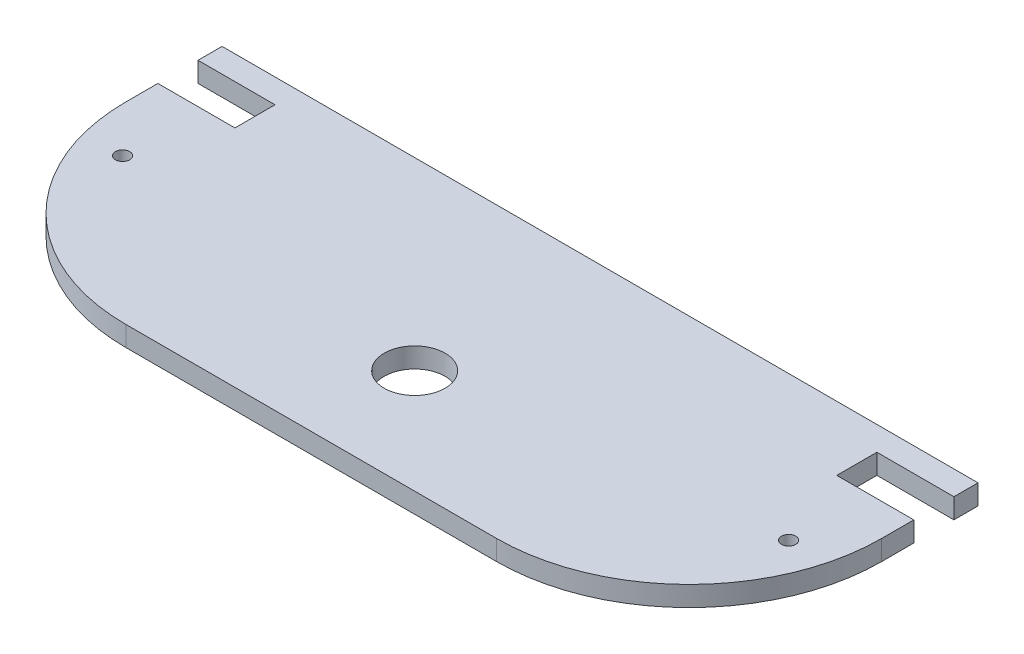
ISO-10303-21;
HEADER;
FILE_DESCRIPTION(('STEP AP214'),'2;1');
FILE_NAME('part.step','',(''),(''),'','','');
FILE_SCHEMA(('AUTOMOTIVE_DESIGN { 1 0 10303 214 1 1 1 1 }'));
ENDSEC;
DATA;
#1=APPLICATION_CONTEXT('core data for automotive mechanical design processes');
#2=APPLICATION_PROTOCOL_DEFINITION('international standard','automotive_design',2000,#1);
#3=PRODUCT_CONTEXT('',#1,'mechanical');
#4=PRODUCT('Part','Part','',(#3));
#5=PRODUCT_RELATED_PRODUCT_CATEGORY('part','',(#4));
#6=PRODUCT_DEFINITION_FORMATION('','',#4);
#7=PRODUCT_DEFINITION_CONTEXT('part definition',#1,'design');
#8=PRODUCT_DEFINITION('design','',#6,#7);
#9=PRODUCT_DEFINITION_SHAPE('','',#8);
#10=(LENGTH_UNIT() NAMED_UNIT(*) SI_UNIT(.MILLI.,.METRE.));
#11=(NAMED_UNIT(*) PLANE_ANGLE_UNIT() SI_UNIT($,.RADIAN.));
#12=(NAMED_UNIT(*) SI_UNIT($,.STERADIAN.) SOLID_ANGLE_UNIT());
#13=UNCERTAINTY_MEASURE_WITH_UNIT(LENGTH_MEASURE(1.E-05),#10,'distance_accuracy_value','');
#14=(GEOMETRIC_REPRESENTATION_CONTEXT(3) GLOBAL_UNCERTAINTY_ASSIGNED_CONTEXT((#13)) GLOBAL_UNIT_ASSIGNED_CONTEXT((#10,
#11,#12)) REPRESENTATION_CONTEXT('',''));
#15=CARTESIAN_POINT('',(0.,0.,0.));
#16=DIRECTION('',(0.,0.,1.));
#17=DIRECTION('',(1.,0.,0.));
#18=AXIS2_PLACEMENT_3D('',#15,#16,#17);
#19=CARTESIAN_POINT('',(0.,3.175,0.));
#20=DIRECTION('',(0.,-1.,0.));
#21=DIRECTION('',(0.,0.,-1.));
#22=AXIS2_PLACEMENT_3D('',#19,#20,#21);
#23=PLANE('',#22);
#24=CARTESIAN_POINT('',(112.521999999993,3.175,-22.8599999999932));
#25=DIRECTION('',(0.,-1.,0.));
#26=DIRECTION('',(0.,0.,-1.));
#27=AXIS2_PLACEMENT_3D('',#24,#25,#26);
#28=CIRCLE('',#27,1.1303);
#29=CARTESIAN_POINT('',(112.521999999993,3.175,-23.9902999999932));
#30=VERTEX_POINT('',#29);
#31=EDGE_CURVE('E297',#30,#30,#28,.T.);
#32=ORIENTED_EDGE('',*,*,#31,.T.);
#33=EDGE_LOOP('',(#32));
#34=FACE_BOUND('',#33,.T.);
#35=CARTESIAN_POINT('',(7.11199999999325,3.175,-22.8599999999929));
#36=DIRECTION('',(0.,-1.,0.));
#37=DIRECTION('',(0.,0.,-1.));
#38=AXIS2_PLACEMENT_3D('',#35,#36,#37);
#39=CIRCLE('',#38,1.1303);
#40=CARTESIAN_POINT('',(7.11199999999325,3.175,-23.9902999999929));
#41=VERTEX_POINT('',#40);
#42=EDGE_CURVE('E279',#41,#41,#39,.T.);
#43=ORIENTED_EDGE('',*,*,#42,.T.);
#44=EDGE_LOOP('',(#43));
#45=FACE_BOUND('',#44,.T.);
#46=DIRECTION('',(0.,0.,1.));
#47=VECTOR('',#46,1.);
#48=CARTESIAN_POINT('',(0.,3.175,0.));
#49=LINE('',#48,#47);
#50=CARTESIAN_POINT('',(0.,3.175,-35.56));
#51=VERTEX_POINT('',#50);
#52=CARTESIAN_POINT('',(0.,3.175,-30.48));
#53=VERTEX_POINT('',#52);
#54=EDGE_CURVE('E219',#51,#53,#49,.T.);
#55=ORIENTED_EDGE('',*,*,#54,.T.);
#56=CARTESIAN_POINT('',(30.48,3.175,-30.48));
#57=DIRECTION('',(0.,-1.,0.));
#58=DIRECTION('',(0.,0.,-1.));
#59=AXIS2_PLACEMENT_3D('',#56,#57,#58);
#60=CIRCLE('',#59,30.48);
#61=CARTESIAN_POINT('',(30.48,3.175,0.));
#62=VERTEX_POINT('',#61);
#63=EDGE_CURVE('E55',#53,#62,#60,.F.);
#64=ORIENTED_EDGE('',*,*,#63,.T.);
#65=DIRECTION('',(1.,0.,0.));
#66=VECTOR('',#65,1.);
#67=CARTESIAN_POINT('',(0.,3.175,0.));
#68=LINE('',#67,#66);
#69=CARTESIAN_POINT('',(89.154,3.175,0.));
#70=VERTEX_POINT('',#69);
#71=EDGE_CURVE('E221',#62,#70,#68,.T.);
#72=ORIENTED_EDGE('',*,*,#71,.T.);
#73=CARTESIAN_POINT('',(89.154,3.175,-30.48));
#74=DIRECTION('',(0.,-1.,0.));
#75=DIRECTION('',(0.,0.,-1.));
#76=AXIS2_PLACEMENT_3D('',#73,#74,#75);
#77=CIRCLE('',#76,30.48);
#78=CARTESIAN_POINT('',(119.634,3.175,-30.48));
#79=VERTEX_POINT('',#78);
#80=EDGE_CURVE('E62',#70,#79,#77,.F.);
#81=ORIENTED_EDGE('',*,*,#80,.T.);
#82=DIRECTION('',(0.,0.,-1.));
#83=VECTOR('',#82,1.);
#84=CARTESIAN_POINT('',(119.634,3.175,0.));
#85=LINE('',#84,#83);
#86=CARTESIAN_POINT('',(119.634,3.175,-35.56));
#87=VERTEX_POINT('',#86);
#88=EDGE_CURVE('E224',#79,#87,#85,.T.);
#89=ORIENTED_EDGE('',*,*,#88,.T.);
#90=DIRECTION('',(1.,0.,0.));
#91=VECTOR('',#90,1.);
#92=CARTESIAN_POINT('',(119.634,3.175,-35.56));
#93=LINE('',#92,#91);
#94=CARTESIAN_POINT('',(107.442,3.175,-35.56));
#95=VERTEX_POINT('',#94);
#96=EDGE_CURVE('E199',#95,#87,#93,.T.);
#97=ORIENTED_EDGE('',*,*,#96,.F.);
#98=DIRECTION('',(0.,0.,1.));
#99=VECTOR('',#98,1.);
#100=CARTESIAN_POINT('',(107.442,3.175,-41.91));
#101=LINE('',#100,#99);
#102=CARTESIAN_POINT('',(107.442,3.175,-41.91));
#103=VERTEX_POINT('',#102);
#104=EDGE_CURVE('E192',#103,#95,#101,.T.);
#105=ORIENTED_EDGE('',*,*,#104,.F.);
#106=DIRECTION('',(1.,0.,0.));
#107=VECTOR('',#106,1.);
#108=CARTESIAN_POINT('',(119.633999999994,3.17499999998344,-41.91));
#109=LINE('',#108,#107);
#110=CARTESIAN_POINT('',(119.633999999994,3.17499999998344,-41.91));
#111=VERTEX_POINT('',#110);
#112=EDGE_CURVE('E284',#103,#111,#109,.T.);
#113=ORIENTED_EDGE('',*,*,#112,.T.);
#114=DIRECTION('',(0.,0.,1.));
#115=VECTOR('',#114,1.);
#116=CARTESIAN_POINT('',(119.633999999994,3.17499999998344,-45.72));
#117=LINE('',#116,#115);
#118=CARTESIAN_POINT('',(119.633999999994,3.17499999998344,-45.72));
#119=VERTEX_POINT('',#118);
#120=EDGE_CURVE('E286',#119,#111,#117,.T.);
#121=ORIENTED_EDGE('',*,*,#120,.F.);
#122=DIRECTION('',(1.,0.,0.));
#123=VECTOR('',#122,1.);
#124=CARTESIAN_POINT('',(119.633999999994,3.17499999998344,-45.72));
#125=LINE('',#124,#123);
#126=CARTESIAN_POINT('',(-5.81479309147426E-12,3.17499999998344,-45.72));
#127=VERTEX_POINT('',#126);
#128=EDGE_CURVE('E170',#127,#119,#125,.T.);
#129=ORIENTED_EDGE('',*,*,#128,.F.);
#130=DIRECTION('',(0.,0.,1.));
#131=VECTOR('',#130,1.);
#132=CARTESIAN_POINT('',(-5.81479309147426E-12,3.17499999998344,-45.72));
#133=LINE('',#132,#131);
#134=CARTESIAN_POINT('',(-5.81479309147426E-12,3.17499999998344,-41.91));
#135=VERTEX_POINT('',#134);
#136=EDGE_CURVE('E184',#127,#135,#133,.T.);
#137=ORIENTED_EDGE('',*,*,#136,.T.);
#138=CARTESIAN_POINT('',(12.192,3.175,-41.91));
#139=VERTEX_POINT('',#138);
#140=EDGE_CURVE('E174',#135,#139,#109,.T.);
#141=ORIENTED_EDGE('',*,*,#140,.T.);
#142=DIRECTION('',(0.,0.,-1.));
#143=VECTOR('',#142,1.);
#144=CARTESIAN_POINT('',(12.192,3.175,-41.91));
#145=LINE('',#144,#143);
#146=CARTESIAN_POINT('',(12.192,3.175,-35.56));
#147=VERTEX_POINT('',#146);
#148=EDGE_CURVE('E191',#147,#139,#145,.T.);
#149=ORIENTED_EDGE('',*,*,#148,.F.);
#150=DIRECTION('',(1.,0.,0.));
#151=VECTOR('',#150,1.);
#152=CARTESIAN_POINT('',(0.,3.175,-35.56));
#153=LINE('',#152,#151);
#154=EDGE_CURVE('E188',#51,#147,#153,.T.);
#155=ORIENTED_EDGE('',*,*,#154,.F.);
#156=EDGE_LOOP('',(#55,#64,#72,#81,#89,#97,#105,#113,#121,#129,#137,#141,#149,#155));
#157=FACE_BOUND('',#156,.T.);
#158=CARTESIAN_POINT('',(59.69,3.175,-16.51));
#159=DIRECTION('',(0.,1.,0.));
#160=DIRECTION('',(0.,0.,1.));
#161=AXIS2_PLACEMENT_3D('',#158,#159,#160);
#162=CIRCLE('',#161,4.81329999999998);
#163=CARTESIAN_POINT('',(59.69,3.175,-11.6967));
#164=VERTEX_POINT('',#163);
#165=EDGE_CURVE('E213',#164,#164,#162,.T.);
#166=ORIENTED_EDGE('',*,*,#165,.F.);
#167=EDGE_LOOP('',(#166));
#168=FACE_BOUND('',#167,.T.);
#169=ADVANCED_FACE('F47',(#34,#45,#157,#168),#23,.F.);
#170=CARTESIAN_POINT('',(0.,0.,0.));
#171=DIRECTION('',(0.,-1.,0.));
#172=DIRECTION('',(0.,0.,-1.));
#173=AXIS2_PLACEMENT_3D('',#170,#171,#172);
#174=PLANE('',#173);
#175=CARTESIAN_POINT('',(112.521999999993,0.,-22.8599999999932));
#176=DIRECTION('',(0.,-1.,0.));
#177=DIRECTION('',(0.,0.,-1.));
#178=AXIS2_PLACEMENT_3D('',#175,#176,#177);
#179=CIRCLE('',#178,1.1303);
#180=CARTESIAN_POINT('',(112.521999999993,0.,-23.9902999999932));
#181=VERTEX_POINT('',#180);
#182=EDGE_CURVE('E300',#181,#181,#179,.T.);
#183=ORIENTED_EDGE('',*,*,#182,.F.);
#184=EDGE_LOOP('',(#183));
#185=FACE_BOUND('',#184,.T.);
#186=CARTESIAN_POINT('',(7.11199999999325,0.,-22.8599999999929));
#187=DIRECTION('',(0.,-1.,0.));
#188=DIRECTION('',(0.,0.,-1.));
#189=AXIS2_PLACEMENT_3D('',#186,#187,#188);
#190=CIRCLE('',#189,1.1303);
#191=CARTESIAN_POINT('',(7.11199999999325,0.,-23.9902999999929));
#192=VERTEX_POINT('',#191);
#193=EDGE_CURVE('E294',#192,#192,#190,.T.);
#194=ORIENTED_EDGE('',*,*,#193,.F.);
#195=EDGE_LOOP('',(#194));
#196=FACE_BOUND('',#195,.T.);
#197=DIRECTION('',(1.,0.,0.));
#198=VECTOR('',#197,1.);
#199=CARTESIAN_POINT('',(0.,0.,0.));
#200=LINE('',#199,#198);
#201=CARTESIAN_POINT('',(30.48,0.,0.));
#202=VERTEX_POINT('',#201);
#203=CARTESIAN_POINT('',(89.154,0.,0.));
#204=VERTEX_POINT('',#203);
#205=EDGE_CURVE('E228',#202,#204,#200,.T.);
#206=ORIENTED_EDGE('',*,*,#205,.F.);
#207=CARTESIAN_POINT('',(30.48,0.,-30.48));
#208=DIRECTION('',(0.,-1.,0.));
#209=DIRECTION('',(0.,0.,-1.));
#210=AXIS2_PLACEMENT_3D('',#207,#208,#209);
#211=CIRCLE('',#210,30.48);
#212=CARTESIAN_POINT('',(0.,0.,-30.48));
#213=VERTEX_POINT('',#212);
#214=EDGE_CURVE('E244',#202,#213,#211,.T.);
#215=ORIENTED_EDGE('',*,*,#214,.T.);
#216=DIRECTION('',(0.,0.,1.));
#217=VECTOR('',#216,1.);
#218=CARTESIAN_POINT('',(0.,0.,0.));
#219=LINE('',#218,#217);
#220=CARTESIAN_POINT('',(0.,0.,-35.56));
#221=VERTEX_POINT('',#220);
#222=EDGE_CURVE('E216',#221,#213,#219,.T.);
#223=ORIENTED_EDGE('',*,*,#222,.F.);
#224=DIRECTION('',(-1.,0.,0.));
#225=VECTOR('',#224,1.);
#226=CARTESIAN_POINT('',(0.,0.,-35.56));
#227=LINE('',#226,#225);
#228=CARTESIAN_POINT('',(12.192,0.,-35.56));
#229=VERTEX_POINT('',#228);
#230=EDGE_CURVE('E210',#229,#221,#227,.T.);
#231=ORIENTED_EDGE('',*,*,#230,.F.);
#232=DIRECTION('',(0.,0.,1.));
#233=VECTOR('',#232,1.);
#234=CARTESIAN_POINT('',(12.192,0.,0.));
#235=LINE('',#234,#233);
#236=CARTESIAN_POINT('',(12.192,0.,-41.91));
#237=VERTEX_POINT('',#236);
#238=EDGE_CURVE('E206',#237,#229,#235,.T.);
#239=ORIENTED_EDGE('',*,*,#238,.F.);
#240=DIRECTION('',(-1.,0.,0.));
#241=VECTOR('',#240,1.);
#242=CARTESIAN_POINT('',(119.633999999994,-1.69864122767649E-11,-41.91));
#243=LINE('',#242,#241);
#244=CARTESIAN_POINT('',(-5.81479309147426E-12,-1.69864122767649E-11,-41.91));
#245=VERTEX_POINT('',#244);
#246=EDGE_CURVE('E275',#237,#245,#243,.T.);
#247=ORIENTED_EDGE('',*,*,#246,.T.);
#248=DIRECTION('',(0.,0.,1.));
#249=VECTOR('',#248,1.);
#250=CARTESIAN_POINT('',(-5.81479309147426E-12,-1.69864122767649E-11,-45.72));
#251=LINE('',#250,#249);
#252=CARTESIAN_POINT('',(-5.81479309147426E-12,-1.69864122767649E-11,-45.72));
#253=VERTEX_POINT('',#252);
#254=EDGE_CURVE('E161',#253,#245,#251,.T.);
#255=ORIENTED_EDGE('',*,*,#254,.F.);
#256=DIRECTION('',(-1.,0.,0.));
#257=VECTOR('',#256,1.);
#258=CARTESIAN_POINT('',(119.633999999994,-1.69864122767649E-11,-45.72));
#259=LINE('',#258,#257);
#260=CARTESIAN_POINT('',(119.633999999994,-1.69864122767649E-11,-45.72));
#261=VERTEX_POINT('',#260);
#262=EDGE_CURVE('E151',#261,#253,#259,.T.);
#263=ORIENTED_EDGE('',*,*,#262,.F.);
#264=DIRECTION('',(0.,0.,1.));
#265=VECTOR('',#264,1.);
#266=CARTESIAN_POINT('',(119.633999999994,-1.69864122767649E-11,-45.72));
#267=LINE('',#266,#265);
#268=CARTESIAN_POINT('',(119.633999999994,-1.69864122767649E-11,-41.91));
#269=VERTEX_POINT('',#268);
#270=EDGE_CURVE('E158',#261,#269,#267,.T.);
#271=ORIENTED_EDGE('',*,*,#270,.T.);
#272=CARTESIAN_POINT('',(107.442,-1.69864122767649E-11,-41.91));
#273=VERTEX_POINT('',#272);
#274=EDGE_CURVE('E277',#269,#273,#243,.T.);
#275=ORIENTED_EDGE('',*,*,#274,.T.);
#276=DIRECTION('',(0.,0.,-1.));
#277=VECTOR('',#276,1.);
#278=CARTESIAN_POINT('',(107.442,0.,0.));
#279=LINE('',#278,#277);
#280=CARTESIAN_POINT('',(107.442,0.,-35.56));
#281=VERTEX_POINT('',#280);
#282=EDGE_CURVE('E197',#281,#273,#279,.T.);
#283=ORIENTED_EDGE('',*,*,#282,.F.);
#284=DIRECTION('',(-1.,0.,0.));
#285=VECTOR('',#284,1.);
#286=CARTESIAN_POINT('',(0.,0.,-35.56));
#287=LINE('',#286,#285);
#288=CARTESIAN_POINT('',(119.634,0.,-35.56));
#289=VERTEX_POINT('',#288);
#290=EDGE_CURVE('E208',#289,#281,#287,.T.);
#291=ORIENTED_EDGE('',*,*,#290,.F.);
#292=DIRECTION('',(0.,0.,-1.));
#293=VECTOR('',#292,1.);
#294=CARTESIAN_POINT('',(119.634,0.,0.));
#295=LINE('',#294,#293);
#296=CARTESIAN_POINT('',(119.634,0.,-30.48));
#297=VERTEX_POINT('',#296);
#298=EDGE_CURVE('E222',#297,#289,#295,.T.);
#299=ORIENTED_EDGE('',*,*,#298,.F.);
#300=CARTESIAN_POINT('',(89.154,0.,-30.48));
#301=DIRECTION('',(0.,-1.,0.));
#302=DIRECTION('',(0.,0.,-1.));
#303=AXIS2_PLACEMENT_3D('',#300,#301,#302);
#304=CIRCLE('',#303,30.48);
#305=EDGE_CURVE('E242',#297,#204,#304,.T.);
#306=ORIENTED_EDGE('',*,*,#305,.T.);
#307=EDGE_LOOP('',(#206,#215,#223,#231,#239,#247,#255,#263,#271,#275,#283,#291,#299,#306));
#308=FACE_BOUND('',#307,.T.);
#309=CARTESIAN_POINT('',(59.69,0.,-16.51));
#310=DIRECTION('',(0.,1.,0.));
#311=DIRECTION('',(0.,0.,1.));
#312=AXIS2_PLACEMENT_3D('',#309,#310,#311);
#313=CIRCLE('',#312,4.81329999999998);
#314=CARTESIAN_POINT('',(59.69,0.,-11.6967));
#315=VERTEX_POINT('',#314);
#316=EDGE_CURVE('E212',#315,#315,#313,.T.);
#317=ORIENTED_EDGE('',*,*,#316,.T.);
#318=EDGE_LOOP('',(#317));
#319=FACE_BOUND('',#318,.T.);
#320=ADVANCED_FACE('F154',(#185,#196,#308,#319),#174,.T.);
#321=CARTESIAN_POINT('',(0.,3.175,0.));
#322=DIRECTION('',(1.,0.,0.));
#323=DIRECTION('',(0.,0.,-1.));
#324=AXIS2_PLACEMENT_3D('',#321,#322,#323);
#325=PLANE('',#324);
#326=ORIENTED_EDGE('',*,*,#222,.T.);
#327=DIRECTION('',(0.,-1.,0.));
#328=VECTOR('',#327,1.);
#329=CARTESIAN_POINT('',(0.,3.175,-30.48));
#330=LINE('',#329,#328);
#331=EDGE_CURVE('E70',#213,#53,#330,.F.);
#332=ORIENTED_EDGE('',*,*,#331,.T.);
#333=ORIENTED_EDGE('',*,*,#54,.F.);
#334=DIRECTION('',(0.,1.,0.));
#335=VECTOR('',#334,1.);
#336=CARTESIAN_POINT('',(0.,-19.177,-35.56));
#337=LINE('',#336,#335);
#338=EDGE_CURVE('E194',#221,#51,#337,.T.);
#339=ORIENTED_EDGE('',*,*,#338,.F.);
#340=EDGE_LOOP('',(#326,#332,#333,#339));
#341=FACE_BOUND('',#340,.T.);
#342=ADVANCED_FACE('F260',(#341),#325,.F.);
#343=CARTESIAN_POINT('',(0.,3.175,0.));
#344=DIRECTION('',(0.,0.,-1.));
#345=DIRECTION('',(-1.,0.,0.));
#346=AXIS2_PLACEMENT_3D('',#343,#344,#345);
#347=PLANE('',#346);
#348=ORIENTED_EDGE('',*,*,#71,.F.);
#349=DIRECTION('',(0.,-1.,0.));
#350=VECTOR('',#349,1.);
#351=CARTESIAN_POINT('',(30.48,3.175,0.));
#352=LINE('',#351,#350);
#353=EDGE_CURVE('E239',#62,#202,#352,.T.);
#354=ORIENTED_EDGE('',*,*,#353,.T.);
#355=ORIENTED_EDGE('',*,*,#205,.T.);
#356=DIRECTION('',(0.,-1.,0.));
#357=VECTOR('',#356,1.);
#358=CARTESIAN_POINT('',(89.154,3.175,0.));
#359=LINE('',#358,#357);
#360=EDGE_CURVE('E237',#204,#70,#359,.F.);
#361=ORIENTED_EDGE('',*,*,#360,.T.);
#362=EDGE_LOOP('',(#348,#354,#355,#361));
#363=FACE_BOUND('',#362,.T.);
#364=ADVANCED_FACE('F254',(#363),#347,.F.);
#365=CARTESIAN_POINT('',(119.634,3.175,0.));
#366=DIRECTION('',(-1.,0.,0.));
#367=DIRECTION('',(0.,0.,1.));
#368=AXIS2_PLACEMENT_3D('',#365,#366,#367);
#369=PLANE('',#368);
#370=ORIENTED_EDGE('',*,*,#88,.F.);
#371=DIRECTION('',(0.,-1.,0.));
#372=VECTOR('',#371,1.);
#373=CARTESIAN_POINT('',(119.634,3.175,-30.48));
#374=LINE('',#373,#372);
#375=EDGE_CURVE('E11',#79,#297,#374,.T.);
#376=ORIENTED_EDGE('',*,*,#375,.T.);
#377=ORIENTED_EDGE('',*,*,#298,.T.);
#378=DIRECTION('',(0.,1.,0.));
#379=VECTOR('',#378,1.);
#380=CARTESIAN_POINT('',(119.634,-19.177,-35.56));
#381=LINE('',#380,#379);
#382=EDGE_CURVE('E179',#289,#87,#381,.T.);
#383=ORIENTED_EDGE('',*,*,#382,.T.);
#384=EDGE_LOOP('',(#370,#376,#377,#383));
#385=FACE_BOUND('',#384,.T.);
#386=ADVANCED_FACE('F328',(#385),#369,.F.);
#387=CARTESIAN_POINT('',(59.69,3.175,-16.51));
#388=DIRECTION('',(0.,-1.,0.));
#389=DIRECTION('',(0.,0.,-1.));
#390=AXIS2_PLACEMENT_3D('',#387,#388,#389);
#391=CYLINDRICAL_SURFACE('',#390,4.81329999999998);
#392=ORIENTED_EDGE('',*,*,#165,.T.);
#393=EDGE_LOOP('',(#392));
#394=FACE_BOUND('',#393,.T.);
#395=ORIENTED_EDGE('',*,*,#316,.F.);
#396=EDGE_LOOP('',(#395));
#397=FACE_BOUND('',#396,.T.);
#398=ADVANCED_FACE('F325',(#394,#397),#391,.F.);
#399=CARTESIAN_POINT('',(119.634,-19.177,-35.56));
#400=DIRECTION('',(0.,0.,1.));
#401=DIRECTION('',(1.,0.,0.));
#402=AXIS2_PLACEMENT_3D('',#399,#400,#401);
#403=PLANE('',#402);
#404=ORIENTED_EDGE('',*,*,#290,.T.);
#405=DIRECTION('',(0.,1.,0.));
#406=VECTOR('',#405,1.);
#407=CARTESIAN_POINT('',(107.442,-19.177,-35.56));
#408=LINE('',#407,#406);
#409=EDGE_CURVE('E182',#281,#95,#408,.T.);
#410=ORIENTED_EDGE('',*,*,#409,.T.);
#411=ORIENTED_EDGE('',*,*,#96,.T.);
#412=ORIENTED_EDGE('',*,*,#382,.F.);
#413=EDGE_LOOP('',(#404,#410,#411,#412));
#414=FACE_BOUND('',#413,.T.);
#415=ADVANCED_FACE('F351',(#414),#403,.F.);
#416=CARTESIAN_POINT('',(107.442,-19.177,-41.91));
#417=DIRECTION('',(-1.,0.,0.));
#418=DIRECTION('',(0.,0.,1.));
#419=AXIS2_PLACEMENT_3D('',#416,#417,#418);
#420=PLANE('',#419);
#421=ORIENTED_EDGE('',*,*,#282,.T.);
#422=DIRECTION('',(0.,-1.,0.));
#423=VECTOR('',#422,1.);
#424=CARTESIAN_POINT('',(107.442,3.175,-41.91));
#425=LINE('',#424,#423);
#426=EDGE_CURVE('E226',#103,#273,#425,.T.);
#427=ORIENTED_EDGE('',*,*,#426,.F.);
#428=ORIENTED_EDGE('',*,*,#104,.T.);
#429=ORIENTED_EDGE('',*,*,#409,.F.);
#430=EDGE_LOOP('',(#421,#427,#428,#429));
#431=FACE_BOUND('',#430,.T.);
#432=ADVANCED_FACE('F346',(#431),#420,.F.);
#433=CARTESIAN_POINT('',(12.192,-19.177,-41.91));
#434=DIRECTION('',(1.,0.,0.));
#435=DIRECTION('',(0.,0.,-1.));
#436=AXIS2_PLACEMENT_3D('',#433,#434,#435);
#437=PLANE('',#436);
#438=ORIENTED_EDGE('',*,*,#238,.T.);
#439=DIRECTION('',(0.,1.,0.));
#440=VECTOR('',#439,1.);
#441=CARTESIAN_POINT('',(12.192,-19.177,-35.56));
#442=LINE('',#441,#440);
#443=EDGE_CURVE('E195',#229,#147,#442,.T.);
#444=ORIENTED_EDGE('',*,*,#443,.T.);
#445=ORIENTED_EDGE('',*,*,#148,.T.);
#446=DIRECTION('',(0.,1.,0.));
#447=VECTOR('',#446,1.);
#448=CARTESIAN_POINT('',(12.192,3.175,-41.91));
#449=LINE('',#448,#447);
#450=EDGE_CURVE('E234',#237,#139,#449,.T.);
#451=ORIENTED_EDGE('',*,*,#450,.F.);
#452=EDGE_LOOP('',(#438,#444,#445,#451));
#453=FACE_BOUND('',#452,.T.);
#454=ADVANCED_FACE('F269',(#453),#437,.F.);
#455=CARTESIAN_POINT('',(0.,-19.177,-35.56));
#456=DIRECTION('',(0.,0.,1.));
#457=DIRECTION('',(1.,0.,0.));
#458=AXIS2_PLACEMENT_3D('',#455,#456,#457);
#459=PLANE('',#458);
#460=ORIENTED_EDGE('',*,*,#230,.T.);
#461=ORIENTED_EDGE('',*,*,#338,.T.);
#462=ORIENTED_EDGE('',*,*,#154,.T.);
#463=ORIENTED_EDGE('',*,*,#443,.F.);
#464=EDGE_LOOP('',(#460,#461,#462,#463));
#465=FACE_BOUND('',#464,.T.);
#466=ADVANCED_FACE('F262',(#465),#459,.F.);
#467=CARTESIAN_POINT('',(30.48,3.175,-30.48));
#468=DIRECTION('',(0.,-1.,0.));
#469=DIRECTION('',(0.,0.,-1.));
#470=AXIS2_PLACEMENT_3D('',#467,#468,#469);
#471=CYLINDRICAL_SURFACE('',#470,30.48);
#472=ORIENTED_EDGE('',*,*,#63,.F.);
#473=ORIENTED_EDGE('',*,*,#331,.F.);
#474=ORIENTED_EDGE('',*,*,#214,.F.);
#475=ORIENTED_EDGE('',*,*,#353,.F.);
#476=EDGE_LOOP('',(#472,#473,#474,#475));
#477=FACE_BOUND('',#476,.T.);
#478=ADVANCED_FACE('F256',(#477),#471,.T.);
#479=CARTESIAN_POINT('',(89.154,3.175,-30.48));
#480=DIRECTION('',(0.,-1.,0.));
#481=DIRECTION('',(0.,0.,-1.));
#482=AXIS2_PLACEMENT_3D('',#479,#480,#481);
#483=CYLINDRICAL_SURFACE('',#482,30.48);
#484=ORIENTED_EDGE('',*,*,#80,.F.);
#485=ORIENTED_EDGE('',*,*,#360,.F.);
#486=ORIENTED_EDGE('',*,*,#305,.F.);
#487=ORIENTED_EDGE('',*,*,#375,.F.);
#488=EDGE_LOOP('',(#484,#485,#486,#487));
#489=FACE_BOUND('',#488,.T.);
#490=ADVANCED_FACE('F49',(#489),#483,.T.);
#491=CARTESIAN_POINT('',(0.,0.,-41.91));
#492=DIRECTION('',(0.,0.,1.));
#493=DIRECTION('',(1.,0.,0.));
#494=AXIS2_PLACEMENT_3D('',#491,#492,#493);
#495=PLANE('',#494);
#496=ORIENTED_EDGE('',*,*,#246,.F.);
#497=ORIENTED_EDGE('',*,*,#450,.T.);
#498=ORIENTED_EDGE('',*,*,#140,.F.);
#499=DIRECTION('',(0.,1.,0.));
#500=VECTOR('',#499,1.);
#501=CARTESIAN_POINT('',(-5.81479309147426E-12,-1.69864122767649E-11,-41.91));
#502=LINE('',#501,#500);
#503=EDGE_CURVE('E276',#245,#135,#502,.T.);
#504=ORIENTED_EDGE('',*,*,#503,.F.);
#505=EDGE_LOOP('',(#496,#497,#498,#504));
#506=FACE_BOUND('',#505,.T.);
#507=ADVANCED_FACE('F273',(#506),#495,.T.);
#508=CARTESIAN_POINT('',(119.633999999994,-1.69864122767649E-11,-45.72));
#509=DIRECTION('',(-1.,0.,0.));
#510=DIRECTION('',(0.,0.,1.));
#511=AXIS2_PLACEMENT_3D('',#508,#509,#510);
#512=PLANE('',#511);
#513=DIRECTION('',(0.,-1.,0.));
#514=VECTOR('',#513,1.);
#515=CARTESIAN_POINT('',(119.633999999994,-1.69864122767649E-11,-41.91));
#516=LINE('',#515,#514);
#517=EDGE_CURVE('E178',#111,#269,#516,.T.);
#518=ORIENTED_EDGE('',*,*,#517,.T.);
#519=ORIENTED_EDGE('',*,*,#270,.F.);
#520=DIRECTION('',(0.,-1.,0.));
#521=VECTOR('',#520,1.);
#522=CARTESIAN_POINT('',(119.633999999994,-1.69864122767649E-11,-45.72));
#523=LINE('',#522,#521);
#524=EDGE_CURVE('E165',#119,#261,#523,.T.);
#525=ORIENTED_EDGE('',*,*,#524,.F.);
#526=ORIENTED_EDGE('',*,*,#120,.T.);
#527=EDGE_LOOP('',(#518,#519,#525,#526));
#528=FACE_BOUND('',#527,.T.);
#529=ADVANCED_FACE('F176',(#528),#512,.F.);
#530=CARTESIAN_POINT('',(-5.81479309147426E-12,-1.69864122767649E-11,-45.72));
#531=DIRECTION('',(1.,0.,0.));
#532=DIRECTION('',(0.,0.,-1.));
#533=AXIS2_PLACEMENT_3D('',#530,#531,#532);
#534=PLANE('',#533);
#535=ORIENTED_EDGE('',*,*,#503,.T.);
#536=ORIENTED_EDGE('',*,*,#136,.F.);
#537=DIRECTION('',(0.,1.,0.));
#538=VECTOR('',#537,1.);
#539=CARTESIAN_POINT('',(-5.81479309147426E-12,-1.69864122767649E-11,-45.72));
#540=LINE('',#539,#538);
#541=EDGE_CURVE('E164',#253,#127,#540,.T.);
#542=ORIENTED_EDGE('',*,*,#541,.F.);
#543=ORIENTED_EDGE('',*,*,#254,.T.);
#544=EDGE_LOOP('',(#535,#536,#542,#543));
#545=FACE_BOUND('',#544,.T.);
#546=ADVANCED_FACE('F289',(#545),#534,.F.);
#547=CARTESIAN_POINT('',(0.,0.,-45.72));
#548=DIRECTION('',(0.,0.,1.));
#549=DIRECTION('',(1.,0.,0.));
#550=AXIS2_PLACEMENT_3D('',#547,#548,#549);
#551=PLANE('',#550);
#552=ORIENTED_EDGE('',*,*,#524,.T.);
#553=ORIENTED_EDGE('',*,*,#262,.T.);
#554=ORIENTED_EDGE('',*,*,#541,.T.);
#555=ORIENTED_EDGE('',*,*,#128,.T.);
#556=EDGE_LOOP('',(#552,#553,#554,#555));
#557=FACE_BOUND('',#556,.T.);
#558=ADVANCED_FACE('F168',(#557),#551,.F.);
#559=ORIENTED_EDGE('',*,*,#112,.F.);
#560=ORIENTED_EDGE('',*,*,#426,.T.);
#561=ORIENTED_EDGE('',*,*,#274,.F.);
#562=ORIENTED_EDGE('',*,*,#517,.F.);
#563=EDGE_LOOP('',(#559,#560,#561,#562));
#564=FACE_BOUND('',#563,.T.);
#565=ADVANCED_FACE('F315',(#564),#495,.T.);
#566=CARTESIAN_POINT('',(7.11199999999325,6.35,-22.8599999999929));
#567=DIRECTION('',(0.,-1.,0.));
#568=DIRECTION('',(0.,0.,-1.));
#569=AXIS2_PLACEMENT_3D('',#566,#567,#568);
#570=CYLINDRICAL_SURFACE('',#569,1.1303);
#571=ORIENTED_EDGE('',*,*,#193,.T.);
#572=EDGE_LOOP('',(#571));
#573=FACE_BOUND('',#572,.T.);
#574=ORIENTED_EDGE('',*,*,#42,.F.);
#575=EDGE_LOOP('',(#574));
#576=FACE_BOUND('',#575,.T.);
#577=ADVANCED_FACE('F312',(#573,#576),#570,.F.);
#578=CARTESIAN_POINT('',(112.521999999993,6.35,-22.8599999999932));
#579=DIRECTION('',(0.,-1.,0.));
#580=DIRECTION('',(0.,0.,-1.));
#581=AXIS2_PLACEMENT_3D('',#578,#579,#580);
#582=CYLINDRICAL_SURFACE('',#581,1.1303);
#583=ORIENTED_EDGE('',*,*,#182,.T.);
#584=EDGE_LOOP('',(#583));
#585=FACE_BOUND('',#584,.T.);
#586=ORIENTED_EDGE('',*,*,#31,.F.);
#587=EDGE_LOOP('',(#586));
#588=FACE_BOUND('',#587,.T.);
#589=ADVANCED_FACE('F304',(#585,#588),#582,.F.);
#590=CLOSED_SHELL('',(#169,#320,#342,#364,#386,#398,#415,#432,#454,#466,#478,#490,#507,#529,
#546,#558,#565,#577,#589));
#591=MANIFOLD_SOLID_BREP('B2',#590);
#592=ADVANCED_BREP_SHAPE_REPRESENTATION('',(#18,#591),#14);
#593=SHAPE_DEFINITION_REPRESENTATION(#9,#592);
ENDSEC;
END-ISO-10303-21;
